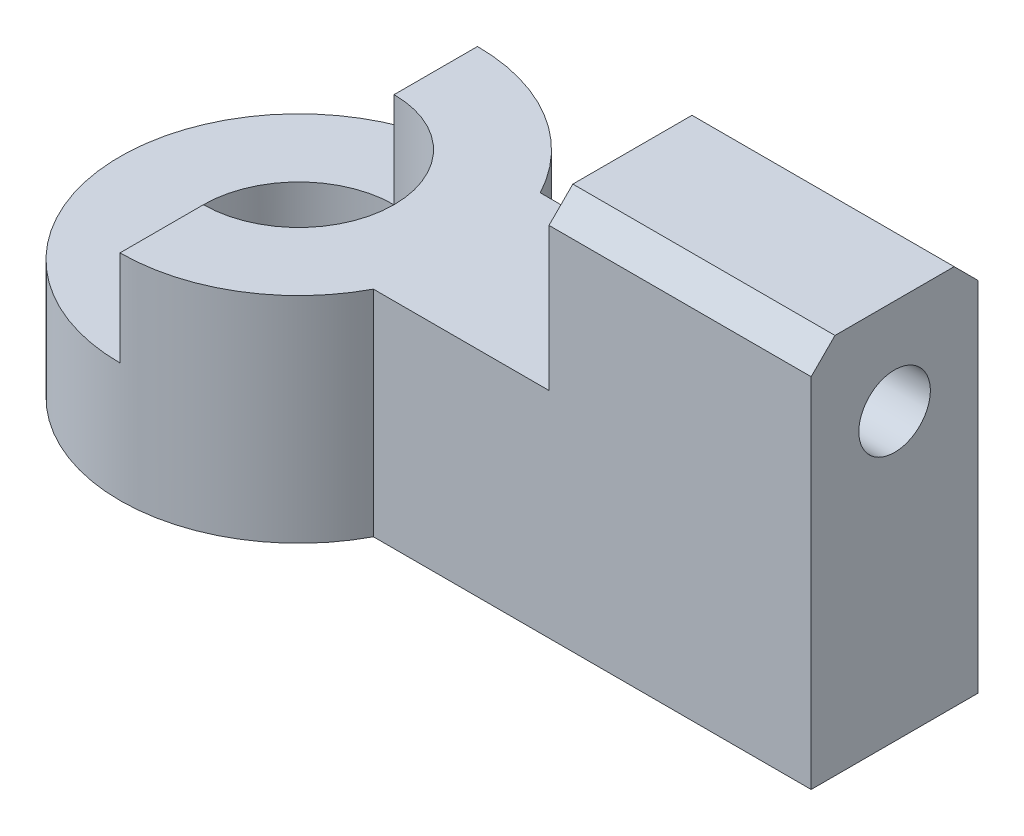
ISO-10303-21;
HEADER;
FILE_DESCRIPTION(('STEP AP214'),'2;1');
FILE_NAME('part.step','',(''),(''),'','','');
FILE_SCHEMA(('AUTOMOTIVE_DESIGN { 1 0 10303 214 1 1 1 1 }'));
ENDSEC;
DATA;
#1=APPLICATION_CONTEXT('core data for automotive mechanical design processes');
#2=APPLICATION_PROTOCOL_DEFINITION('international standard','automotive_design',2000,#1);
#3=PRODUCT_CONTEXT('',#1,'mechanical');
#4=PRODUCT('Part','Part','',(#3));
#5=PRODUCT_RELATED_PRODUCT_CATEGORY('part','',(#4));
#6=PRODUCT_DEFINITION_FORMATION('','',#4);
#7=PRODUCT_DEFINITION_CONTEXT('part definition',#1,'design');
#8=PRODUCT_DEFINITION('design','',#6,#7);
#9=PRODUCT_DEFINITION_SHAPE('','',#8);
#10=(LENGTH_UNIT() NAMED_UNIT(*) SI_UNIT(.MILLI.,.METRE.));
#11=(NAMED_UNIT(*) PLANE_ANGLE_UNIT() SI_UNIT($,.RADIAN.));
#12=(NAMED_UNIT(*) SI_UNIT($,.STERADIAN.) SOLID_ANGLE_UNIT());
#13=UNCERTAINTY_MEASURE_WITH_UNIT(LENGTH_MEASURE(1.E-05),#10,'distance_accuracy_value','');
#14=(GEOMETRIC_REPRESENTATION_CONTEXT(3) GLOBAL_UNCERTAINTY_ASSIGNED_CONTEXT((#13)) GLOBAL_UNIT_ASSIGNED_CONTEXT((#10,
#11,#12)) REPRESENTATION_CONTEXT('',''));
#15=CARTESIAN_POINT('',(0.,0.,0.));
#16=DIRECTION('',(0.,0.,1.));
#17=DIRECTION('',(1.,0.,0.));
#18=AXIS2_PLACEMENT_3D('',#15,#16,#17);
#19=CARTESIAN_POINT('',(0.,18.,0.));
#20=DIRECTION('',(0.,1.,0.));
#21=DIRECTION('',(0.,0.,1.));
#22=AXIS2_PLACEMENT_3D('',#19,#20,#21);
#23=PLANE('',#22);
#24=DIRECTION('',(1.,0.,0.));
#25=VECTOR('',#24,1.);
#26=CARTESIAN_POINT('',(0.,18.,7.));
#27=LINE('',#26,#25);
#28=CARTESIAN_POINT('',(13.2664991614216,18.,7.));
#29=VERTEX_POINT('',#28);
#30=CARTESIAN_POINT('',(28.,18.,7.));
#31=VERTEX_POINT('',#30);
#32=EDGE_CURVE('E143',#29,#31,#27,.T.);
#33=ORIENTED_EDGE('',*,*,#32,.T.);
#34=DIRECTION('',(0.,0.,-1.));
#35=VECTOR('',#34,1.);
#36=CARTESIAN_POINT('',(28.,18.,0.));
#37=LINE('',#36,#35);
#38=CARTESIAN_POINT('',(28.,18.,-7.));
#39=VERTEX_POINT('',#38);
#40=EDGE_CURVE('E149',#31,#39,#37,.T.);
#41=ORIENTED_EDGE('',*,*,#40,.T.);
#42=DIRECTION('',(1.,0.,0.));
#43=VECTOR('',#42,1.);
#44=CARTESIAN_POINT('',(0.,18.,-7.));
#45=LINE('',#44,#43);
#46=CARTESIAN_POINT('',(13.2664991614216,18.,-7.));
#47=VERTEX_POINT('',#46);
#48=EDGE_CURVE('E164',#47,#39,#45,.T.);
#49=ORIENTED_EDGE('',*,*,#48,.F.);
#50=CARTESIAN_POINT('',(0.,18.,0.));
#51=DIRECTION('',(0.,1.,0.));
#52=DIRECTION('',(0.,0.,1.));
#53=AXIS2_PLACEMENT_3D('',#50,#51,#52);
#54=CIRCLE('',#53,15.);
#55=CARTESIAN_POINT('',(0.,18.,-15.));
#56=VERTEX_POINT('',#55);
#57=EDGE_CURVE('E168',#47,#56,#54,.T.);
#58=ORIENTED_EDGE('',*,*,#57,.T.);
#59=DIRECTION('',(0.,0.,-1.));
#60=VECTOR('',#59,1.);
#61=CARTESIAN_POINT('',(0.,18.,0.));
#62=LINE('',#61,#60);
#63=CARTESIAN_POINT('',(0.,18.,-8.));
#64=VERTEX_POINT('',#63);
#65=EDGE_CURVE('E179',#64,#56,#62,.T.);
#66=ORIENTED_EDGE('',*,*,#65,.F.);
#67=CARTESIAN_POINT('',(0.,18.,0.));
#68=DIRECTION('',(0.,1.,0.));
#69=DIRECTION('',(0.,0.,1.));
#70=AXIS2_PLACEMENT_3D('',#67,#68,#69);
#71=CIRCLE('',#70,8.);
#72=CARTESIAN_POINT('',(0.,18.,8.));
#73=VERTEX_POINT('',#72);
#74=EDGE_CURVE('E263',#73,#64,#71,.T.);
#75=ORIENTED_EDGE('',*,*,#74,.F.);
#76=CARTESIAN_POINT('',(0.,18.,15.));
#77=VERTEX_POINT('',#76);
#78=EDGE_CURVE('E170',#77,#73,#62,.T.);
#79=ORIENTED_EDGE('',*,*,#78,.F.);
#80=EDGE_CURVE('E162',#77,#29,#54,.T.);
#81=ORIENTED_EDGE('',*,*,#80,.T.);
#82=EDGE_LOOP('',(#33,#41,#49,#58,#66,#75,#79,#81));
#83=FACE_BOUND('',#82,.T.);
#84=ADVANCED_FACE('F49',(#83),#23,.T.);
#85=CARTESIAN_POINT('',(0.,10.,-7.));
#86=DIRECTION('',(0.,0.,-1.));
#87=DIRECTION('',(-1.,0.,0.));
#88=AXIS2_PLACEMENT_3D('',#85,#86,#87);
#89=PLANE('',#88);
#90=DIRECTION('',(0.,-1.,0.));
#91=VECTOR('',#90,1.);
#92=CARTESIAN_POINT('',(28.,32.,-7.));
#93=LINE('',#92,#91);
#94=CARTESIAN_POINT('',(28.,30.,-7.));
#95=VERTEX_POINT('',#94);
#96=EDGE_CURVE('E145',#95,#39,#93,.T.);
#97=ORIENTED_EDGE('',*,*,#96,.F.);
#98=DIRECTION('',(1.,0.,0.));
#99=VECTOR('',#98,1.);
#100=CARTESIAN_POINT('',(0.,30.,-7.));
#101=LINE('',#100,#99);
#102=CARTESIAN_POINT('',(50.,30.,-7.));
#103=VERTEX_POINT('',#102);
#104=EDGE_CURVE('E156',#95,#103,#101,.T.);
#105=ORIENTED_EDGE('',*,*,#104,.T.);
#106=DIRECTION('',(0.,-1.,0.));
#107=VECTOR('',#106,1.);
#108=CARTESIAN_POINT('',(50.,10.,-7.));
#109=LINE('',#108,#107);
#110=CARTESIAN_POINT('',(50.,0.,-7.));
#111=VERTEX_POINT('',#110);
#112=EDGE_CURVE('E208',#103,#111,#109,.T.);
#113=ORIENTED_EDGE('',*,*,#112,.T.);
#114=DIRECTION('',(1.,0.,0.));
#115=VECTOR('',#114,1.);
#116=CARTESIAN_POINT('',(0.,0.,-7.));
#117=LINE('',#116,#115);
#118=CARTESIAN_POINT('',(13.2664991614216,0.,-7.));
#119=VERTEX_POINT('',#118);
#120=EDGE_CURVE('E199',#119,#111,#117,.T.);
#121=ORIENTED_EDGE('',*,*,#120,.F.);
#122=DIRECTION('',(0.,-1.,0.));
#123=VECTOR('',#122,1.);
#124=CARTESIAN_POINT('',(13.2664991614216,10.,-7.));
#125=LINE('',#124,#123);
#126=EDGE_CURVE('E157',#47,#119,#125,.T.);
#127=ORIENTED_EDGE('',*,*,#126,.F.);
#128=ORIENTED_EDGE('',*,*,#48,.T.);
#129=EDGE_LOOP('',(#97,#105,#113,#121,#127,#128));
#130=FACE_BOUND('',#129,.T.);
#131=ADVANCED_FACE('F260',(#130),#89,.T.);
#132=CARTESIAN_POINT('',(0.,10.,0.));
#133=DIRECTION('',(0.,-1.,0.));
#134=DIRECTION('',(0.,0.,-1.));
#135=AXIS2_PLACEMENT_3D('',#132,#133,#134);
#136=CYLINDRICAL_SURFACE('',#135,15.);
#137=CARTESIAN_POINT('',(0.,0.,0.));
#138=DIRECTION('',(0.,1.,0.));
#139=DIRECTION('',(0.,0.,1.));
#140=AXIS2_PLACEMENT_3D('',#137,#138,#139);
#141=CIRCLE('',#140,15.);
#142=CARTESIAN_POINT('',(13.2664991614216,0.,7.));
#143=VERTEX_POINT('',#142);
#144=EDGE_CURVE('E212',#119,#143,#141,.T.);
#145=ORIENTED_EDGE('',*,*,#144,.T.);
#146=DIRECTION('',(0.,-1.,0.));
#147=VECTOR('',#146,1.);
#148=CARTESIAN_POINT('',(13.2664991614216,10.,7.));
#149=LINE('',#148,#147);
#150=EDGE_CURVE('E231',#29,#143,#149,.T.);
#151=ORIENTED_EDGE('',*,*,#150,.F.);
#152=ORIENTED_EDGE('',*,*,#80,.F.);
#153=DIRECTION('',(0.,-1.,0.));
#154=VECTOR('',#153,1.);
#155=CARTESIAN_POINT('',(0.,18.,15.));
#156=LINE('',#155,#154);
#157=CARTESIAN_POINT('',(0.,10.,15.));
#158=VERTEX_POINT('',#157);
#159=EDGE_CURVE('E183',#77,#158,#156,.T.);
#160=ORIENTED_EDGE('',*,*,#159,.T.);
#161=CARTESIAN_POINT('',(0.,10.,0.));
#162=DIRECTION('',(0.,1.,0.));
#163=DIRECTION('',(0.,0.,1.));
#164=AXIS2_PLACEMENT_3D('',#161,#162,#163);
#165=CIRCLE('',#164,15.);
#166=CARTESIAN_POINT('',(0.,10.,-15.));
#167=VERTEX_POINT('',#166);
#168=EDGE_CURVE('E200',#167,#158,#165,.T.);
#169=ORIENTED_EDGE('',*,*,#168,.F.);
#170=DIRECTION('',(0.,-1.,0.));
#171=VECTOR('',#170,1.);
#172=CARTESIAN_POINT('',(0.,18.,-15.));
#173=LINE('',#172,#171);
#174=EDGE_CURVE('E178',#56,#167,#173,.T.);
#175=ORIENTED_EDGE('',*,*,#174,.F.);
#176=ORIENTED_EDGE('',*,*,#57,.F.);
#177=ORIENTED_EDGE('',*,*,#126,.T.);
#178=EDGE_LOOP('',(#145,#151,#152,#160,#169,#175,#176,#177));
#179=FACE_BOUND('',#178,.T.);
#180=ADVANCED_FACE('F296',(#179),#136,.T.);
#181=CARTESIAN_POINT('',(0.,10.,7.));
#182=DIRECTION('',(0.,0.,-1.));
#183=DIRECTION('',(-1.,0.,0.));
#184=AXIS2_PLACEMENT_3D('',#181,#182,#183);
#185=PLANE('',#184);
#186=DIRECTION('',(0.,-1.,0.));
#187=VECTOR('',#186,1.);
#188=CARTESIAN_POINT('',(50.,10.,7.));
#189=LINE('',#188,#187);
#190=CARTESIAN_POINT('',(50.,30.,7.));
#191=VERTEX_POINT('',#190);
#192=CARTESIAN_POINT('',(50.,0.,7.));
#193=VERTEX_POINT('',#192);
#194=EDGE_CURVE('E228',#191,#193,#189,.T.);
#195=ORIENTED_EDGE('',*,*,#194,.F.);
#196=DIRECTION('',(-1.,0.,0.));
#197=VECTOR('',#196,1.);
#198=CARTESIAN_POINT('',(28.,30.,7.));
#199=LINE('',#198,#197);
#200=CARTESIAN_POINT('',(28.,30.,7.));
#201=VERTEX_POINT('',#200);
#202=EDGE_CURVE('E11',#191,#201,#199,.T.);
#203=ORIENTED_EDGE('',*,*,#202,.T.);
#204=DIRECTION('',(0.,-1.,0.));
#205=VECTOR('',#204,1.);
#206=CARTESIAN_POINT('',(28.,32.,7.));
#207=LINE('',#206,#205);
#208=EDGE_CURVE('E138',#201,#31,#207,.T.);
#209=ORIENTED_EDGE('',*,*,#208,.T.);
#210=ORIENTED_EDGE('',*,*,#32,.F.);
#211=ORIENTED_EDGE('',*,*,#150,.T.);
#212=DIRECTION('',(1.,0.,0.));
#213=VECTOR('',#212,1.);
#214=CARTESIAN_POINT('',(0.,0.,7.));
#215=LINE('',#214,#213);
#216=EDGE_CURVE('E215',#143,#193,#215,.T.);
#217=ORIENTED_EDGE('',*,*,#216,.T.);
#218=EDGE_LOOP('',(#195,#203,#209,#210,#211,#217));
#219=FACE_BOUND('',#218,.T.);
#220=ADVANCED_FACE('F140',(#219),#185,.F.);
#221=CARTESIAN_POINT('',(50.,10.,0.));
#222=DIRECTION('',(1.,0.,0.));
#223=DIRECTION('',(0.,0.,-1.));
#224=AXIS2_PLACEMENT_3D('',#221,#222,#223);
#225=PLANE('',#224);
#226=CARTESIAN_POINT('',(50.,24.,0.));
#227=DIRECTION('',(-1.,0.,0.));
#228=DIRECTION('',(0.,0.,1.));
#229=AXIS2_PLACEMENT_3D('',#226,#227,#228);
#230=CIRCLE('',#229,3.);
#231=CARTESIAN_POINT('',(50.,24.,3.));
#232=VERTEX_POINT('',#231);
#233=EDGE_CURVE('E277',#232,#232,#230,.T.);
#234=ORIENTED_EDGE('',*,*,#233,.T.);
#235=EDGE_LOOP('',(#234));
#236=FACE_BOUND('',#235,.T.);
#237=ORIENTED_EDGE('',*,*,#112,.F.);
#238=DIRECTION('',(0.,-0.707106781186545,-0.70710678118655));
#239=VECTOR('',#238,1.);
#240=CARTESIAN_POINT('',(50.,23.5000000000001,-13.5));
#241=LINE('',#240,#239);
#242=CARTESIAN_POINT('',(50.,32.,-5.));
#243=VERTEX_POINT('',#242);
#244=EDGE_CURVE('E242',#103,#243,#241,.F.);
#245=ORIENTED_EDGE('',*,*,#244,.T.);
#246=DIRECTION('',(0.,0.,1.));
#247=VECTOR('',#246,1.);
#248=CARTESIAN_POINT('',(50.,32.,0.));
#249=LINE('',#248,#247);
#250=CARTESIAN_POINT('',(50.,32.,5.));
#251=VERTEX_POINT('',#250);
#252=EDGE_CURVE('E146',#243,#251,#249,.T.);
#253=ORIENTED_EDGE('',*,*,#252,.T.);
#254=DIRECTION('',(0.,-0.707106781186549,0.707106781186546));
#255=VECTOR('',#254,1.);
#256=CARTESIAN_POINT('',(50.,23.5,13.5));
#257=LINE('',#256,#255);
#258=EDGE_CURVE('E239',#251,#191,#257,.T.);
#259=ORIENTED_EDGE('',*,*,#258,.T.);
#260=ORIENTED_EDGE('',*,*,#194,.T.);
#261=DIRECTION('',(0.,0.,1.));
#262=VECTOR('',#261,1.);
#263=CARTESIAN_POINT('',(50.,0.,0.));
#264=LINE('',#263,#262);
#265=EDGE_CURVE('E219',#111,#193,#264,.T.);
#266=ORIENTED_EDGE('',*,*,#265,.F.);
#267=EDGE_LOOP('',(#237,#245,#253,#259,#260,#266));
#268=FACE_BOUND('',#267,.T.);
#269=ADVANCED_FACE('F269',(#236,#268),#225,.T.);
#270=CARTESIAN_POINT('',(0.,10.,0.));
#271=DIRECTION('',(0.,-1.,0.));
#272=DIRECTION('',(0.,0.,-1.));
#273=AXIS2_PLACEMENT_3D('',#270,#271,#272);
#274=CYLINDRICAL_SURFACE('',#273,8.);
#275=CARTESIAN_POINT('',(0.,10.,0.));
#276=DIRECTION('',(0.,1.,0.));
#277=DIRECTION('',(0.,0.,1.));
#278=AXIS2_PLACEMENT_3D('',#275,#276,#277);
#279=CIRCLE('',#278,8.);
#280=CARTESIAN_POINT('',(0.,10.,-8.));
#281=VERTEX_POINT('',#280);
#282=CARTESIAN_POINT('',(0.,10.,8.));
#283=VERTEX_POINT('',#282);
#284=EDGE_CURVE('E203',#281,#283,#279,.T.);
#285=ORIENTED_EDGE('',*,*,#284,.T.);
#286=DIRECTION('',(0.,-1.,0.));
#287=VECTOR('',#286,1.);
#288=CARTESIAN_POINT('',(0.,18.,8.));
#289=LINE('',#288,#287);
#290=EDGE_CURVE('E187',#73,#283,#289,.T.);
#291=ORIENTED_EDGE('',*,*,#290,.F.);
#292=ORIENTED_EDGE('',*,*,#74,.T.);
#293=DIRECTION('',(0.,-1.,0.));
#294=VECTOR('',#293,1.);
#295=CARTESIAN_POINT('',(0.,18.,-8.));
#296=LINE('',#295,#294);
#297=EDGE_CURVE('E174',#64,#281,#296,.T.);
#298=ORIENTED_EDGE('',*,*,#297,.T.);
#299=EDGE_LOOP('',(#285,#291,#292,#298));
#300=FACE_BOUND('',#299,.T.);
#301=CARTESIAN_POINT('',(0.,0.,0.));
#302=DIRECTION('',(0.,1.,0.));
#303=DIRECTION('',(0.,0.,1.));
#304=AXIS2_PLACEMENT_3D('',#301,#302,#303);
#305=CIRCLE('',#304,8.);
#306=CARTESIAN_POINT('',(0.,0.,8.));
#307=VERTEX_POINT('',#306);
#308=EDGE_CURVE('E204',#307,#307,#305,.T.);
#309=ORIENTED_EDGE('',*,*,#308,.F.);
#310=EDGE_LOOP('',(#309));
#311=FACE_BOUND('',#310,.T.);
#312=ADVANCED_FACE('F300',(#300,#311),#274,.F.);
#313=CARTESIAN_POINT('',(0.,10.,0.));
#314=DIRECTION('',(0.,1.,0.));
#315=DIRECTION('',(0.,0.,1.));
#316=AXIS2_PLACEMENT_3D('',#313,#314,#315);
#317=PLANE('',#316);
#318=DIRECTION('',(0.,0.,1.));
#319=VECTOR('',#318,1.);
#320=CARTESIAN_POINT('',(0.,10.,0.));
#321=LINE('',#320,#319);
#322=EDGE_CURVE('E195',#283,#158,#321,.T.);
#323=ORIENTED_EDGE('',*,*,#322,.F.);
#324=ORIENTED_EDGE('',*,*,#284,.F.);
#325=DIRECTION('',(0.,0.,1.));
#326=VECTOR('',#325,1.);
#327=CARTESIAN_POINT('',(0.,10.,0.));
#328=LINE('',#327,#326);
#329=EDGE_CURVE('E191',#167,#281,#328,.T.);
#330=ORIENTED_EDGE('',*,*,#329,.F.);
#331=ORIENTED_EDGE('',*,*,#168,.T.);
#332=EDGE_LOOP('',(#323,#324,#330,#331));
#333=FACE_BOUND('',#332,.T.);
#334=ADVANCED_FACE('F331',(#333),#317,.T.);
#335=CARTESIAN_POINT('',(0.,0.,0.));
#336=DIRECTION('',(0.,1.,0.));
#337=DIRECTION('',(0.,0.,1.));
#338=AXIS2_PLACEMENT_3D('',#335,#336,#337);
#339=PLANE('',#338);
#340=ORIENTED_EDGE('',*,*,#265,.T.);
#341=ORIENTED_EDGE('',*,*,#216,.F.);
#342=ORIENTED_EDGE('',*,*,#144,.F.);
#343=ORIENTED_EDGE('',*,*,#120,.T.);
#344=EDGE_LOOP('',(#340,#341,#342,#343));
#345=FACE_BOUND('',#344,.T.);
#346=ORIENTED_EDGE('',*,*,#308,.T.);
#347=EDGE_LOOP('',(#346));
#348=FACE_BOUND('',#347,.T.);
#349=ADVANCED_FACE('F306',(#345,#348),#339,.F.);
#350=CARTESIAN_POINT('',(0.,18.,0.));
#351=DIRECTION('',(-1.,0.,0.));
#352=DIRECTION('',(0.,0.,1.));
#353=AXIS2_PLACEMENT_3D('',#350,#351,#352);
#354=PLANE('',#353);
#355=ORIENTED_EDGE('',*,*,#290,.T.);
#356=ORIENTED_EDGE('',*,*,#322,.T.);
#357=ORIENTED_EDGE('',*,*,#159,.F.);
#358=ORIENTED_EDGE('',*,*,#78,.T.);
#359=EDGE_LOOP('',(#355,#356,#357,#358));
#360=FACE_BOUND('',#359,.T.);
#361=ADVANCED_FACE('F302',(#360),#354,.T.);
#362=ORIENTED_EDGE('',*,*,#174,.T.);
#363=ORIENTED_EDGE('',*,*,#329,.T.);
#364=ORIENTED_EDGE('',*,*,#297,.F.);
#365=ORIENTED_EDGE('',*,*,#65,.T.);
#366=EDGE_LOOP('',(#362,#363,#364,#365));
#367=FACE_BOUND('',#366,.T.);
#368=ADVANCED_FACE('F297',(#367),#354,.T.);
#369=CARTESIAN_POINT('',(28.,32.,0.));
#370=DIRECTION('',(1.,0.,0.));
#371=DIRECTION('',(0.,0.,-1.));
#372=AXIS2_PLACEMENT_3D('',#369,#370,#371);
#373=PLANE('',#372);
#374=CARTESIAN_POINT('',(28.,24.,0.));
#375=DIRECTION('',(-1.,0.,0.));
#376=DIRECTION('',(0.,0.,1.));
#377=AXIS2_PLACEMENT_3D('',#374,#375,#376);
#378=CIRCLE('',#377,3.);
#379=CARTESIAN_POINT('',(28.,24.,3.));
#380=VERTEX_POINT('',#379);
#381=EDGE_CURVE('E440',#380,#380,#378,.T.);
#382=ORIENTED_EDGE('',*,*,#381,.F.);
#383=EDGE_LOOP('',(#382));
#384=FACE_BOUND('',#383,.T.);
#385=DIRECTION('',(0.,0.,1.));
#386=VECTOR('',#385,1.);
#387=CARTESIAN_POINT('',(28.,32.,0.));
#388=LINE('',#387,#386);
#389=CARTESIAN_POINT('',(28.,32.,-5.));
#390=VERTEX_POINT('',#389);
#391=CARTESIAN_POINT('',(28.,32.,5.));
#392=VERTEX_POINT('',#391);
#393=EDGE_CURVE('E255',#390,#392,#388,.T.);
#394=ORIENTED_EDGE('',*,*,#393,.F.);
#395=DIRECTION('',(0.,0.707106781186545,0.70710678118655));
#396=VECTOR('',#395,1.);
#397=CARTESIAN_POINT('',(28.,30.,-7.));
#398=LINE('',#397,#396);
#399=EDGE_CURVE('E59',#390,#95,#398,.F.);
#400=ORIENTED_EDGE('',*,*,#399,.T.);
#401=ORIENTED_EDGE('',*,*,#96,.T.);
#402=ORIENTED_EDGE('',*,*,#40,.F.);
#403=ORIENTED_EDGE('',*,*,#208,.F.);
#404=DIRECTION('',(0.,0.707106781186549,-0.707106781186546));
#405=VECTOR('',#404,1.);
#406=CARTESIAN_POINT('',(28.,32.,5.));
#407=LINE('',#406,#405);
#408=EDGE_CURVE('E71',#201,#392,#407,.T.);
#409=ORIENTED_EDGE('',*,*,#408,.T.);
#410=EDGE_LOOP('',(#394,#400,#401,#402,#403,#409));
#411=FACE_BOUND('',#410,.T.);
#412=ADVANCED_FACE('F150',(#384,#411),#373,.F.);
#413=CARTESIAN_POINT('',(0.,32.,0.));
#414=DIRECTION('',(0.,1.,0.));
#415=DIRECTION('',(0.,0.,1.));
#416=AXIS2_PLACEMENT_3D('',#413,#414,#415);
#417=PLANE('',#416);
#418=ORIENTED_EDGE('',*,*,#252,.F.);
#419=DIRECTION('',(-1.,0.,0.));
#420=VECTOR('',#419,1.);
#421=CARTESIAN_POINT('',(0.,32.,-4.99999999999999));
#422=LINE('',#421,#420);
#423=EDGE_CURVE('E249',#243,#390,#422,.T.);
#424=ORIENTED_EDGE('',*,*,#423,.T.);
#425=ORIENTED_EDGE('',*,*,#393,.T.);
#426=DIRECTION('',(1.,0.,0.));
#427=VECTOR('',#426,1.);
#428=CARTESIAN_POINT('',(50.,32.,5.));
#429=LINE('',#428,#427);
#430=EDGE_CURVE('E245',#392,#251,#429,.T.);
#431=ORIENTED_EDGE('',*,*,#430,.T.);
#432=EDGE_LOOP('',(#418,#424,#425,#431));
#433=FACE_BOUND('',#432,.T.);
#434=ADVANCED_FACE('F272',(#433),#417,.T.);
#435=CARTESIAN_POINT('',(0.,30.,-7.));
#436=DIRECTION('',(0.,-0.70710678118655,0.707106781186545));
#437=DIRECTION('',(1.,0.,0.));
#438=AXIS2_PLACEMENT_3D('',#435,#436,#437);
#439=PLANE('',#438);
#440=ORIENTED_EDGE('',*,*,#399,.F.);
#441=ORIENTED_EDGE('',*,*,#423,.F.);
#442=ORIENTED_EDGE('',*,*,#244,.F.);
#443=ORIENTED_EDGE('',*,*,#104,.F.);
#444=EDGE_LOOP('',(#440,#441,#442,#443));
#445=FACE_BOUND('',#444,.T.);
#446=ADVANCED_FACE('F265',(#445),#439,.F.);
#447=CARTESIAN_POINT('',(0.,32.,5.));
#448=DIRECTION('',(0.,0.707106781186546,0.707106781186549));
#449=DIRECTION('',(-1.,0.,0.));
#450=AXIS2_PLACEMENT_3D('',#447,#448,#449);
#451=PLANE('',#450);
#452=ORIENTED_EDGE('',*,*,#408,.F.);
#453=ORIENTED_EDGE('',*,*,#202,.F.);
#454=ORIENTED_EDGE('',*,*,#258,.F.);
#455=ORIENTED_EDGE('',*,*,#430,.F.);
#456=EDGE_LOOP('',(#452,#453,#454,#455));
#457=FACE_BOUND('',#456,.T.);
#458=ADVANCED_FACE('F52',(#457),#451,.T.);
#459=CARTESIAN_POINT('',(50.,24.,0.));
#460=DIRECTION('',(-1.,0.,0.));
#461=DIRECTION('',(0.,0.,1.));
#462=AXIS2_PLACEMENT_3D('',#459,#460,#461);
#463=CYLINDRICAL_SURFACE('',#462,3.);
#464=ORIENTED_EDGE('',*,*,#233,.F.);
#465=EDGE_LOOP('',(#464));
#466=FACE_BOUND('',#465,.T.);
#467=ORIENTED_EDGE('',*,*,#381,.T.);
#468=EDGE_LOOP('',(#467));
#469=FACE_BOUND('',#468,.T.);
#470=ADVANCED_FACE('F311',(#466,#469),#463,.F.);
#471=CLOSED_SHELL('',(#84,#131,#180,#220,#269,#312,#334,#349,#361,#368,#412,#434,#446,#458,#470));
#472=MANIFOLD_SOLID_BREP('B2',#471);
#473=ADVANCED_BREP_SHAPE_REPRESENTATION('',(#18,#472),#14);
#474=SHAPE_DEFINITION_REPRESENTATION(#9,#473);
ENDSEC;
END-ISO-10303-21;
